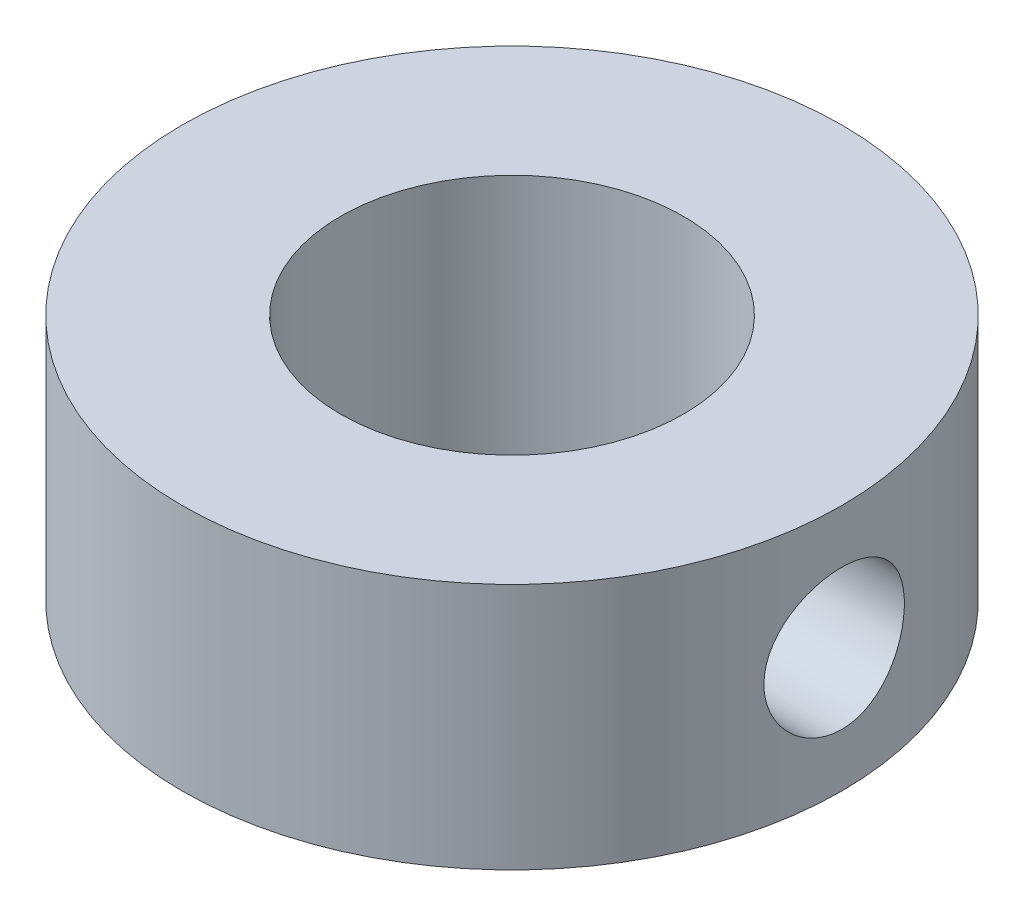
ISO-10303-21;
HEADER;
FILE_DESCRIPTION(('STEP AP214'),'2;1');
FILE_NAME('part.step','',(''),(''),'','','');
FILE_SCHEMA(('AUTOMOTIVE_DESIGN { 1 0 10303 214 1 1 1 1 }'));
ENDSEC;
DATA;
#1=APPLICATION_CONTEXT('core data for automotive mechanical design processes');
#2=APPLICATION_PROTOCOL_DEFINITION('international standard','automotive_design',2000,#1);
#3=PRODUCT_CONTEXT('',#1,'mechanical');
#4=PRODUCT('Part','Part','',(#3));
#5=PRODUCT_RELATED_PRODUCT_CATEGORY('part','',(#4));
#6=PRODUCT_DEFINITION_FORMATION('','',#4);
#7=PRODUCT_DEFINITION_CONTEXT('part definition',#1,'design');
#8=PRODUCT_DEFINITION('design','',#6,#7);
#9=PRODUCT_DEFINITION_SHAPE('','',#8);
#10=(LENGTH_UNIT() NAMED_UNIT(*) SI_UNIT(.MILLI.,.METRE.));
#11=(NAMED_UNIT(*) PLANE_ANGLE_UNIT() SI_UNIT($,.RADIAN.));
#12=(NAMED_UNIT(*) SI_UNIT($,.STERADIAN.) SOLID_ANGLE_UNIT());
#13=UNCERTAINTY_MEASURE_WITH_UNIT(LENGTH_MEASURE(1.E-05),#10,'distance_accuracy_value','');
#14=(GEOMETRIC_REPRESENTATION_CONTEXT(3) GLOBAL_UNCERTAINTY_ASSIGNED_CONTEXT((#13)) GLOBAL_UNIT_ASSIGNED_CONTEXT((#10,
#11,#12)) REPRESENTATION_CONTEXT('',''));
#15=CARTESIAN_POINT('',(0.,0.,0.));
#16=DIRECTION('',(0.,0.,1.));
#17=DIRECTION('',(1.,0.,0.));
#18=AXIS2_PLACEMENT_3D('',#15,#16,#17);
#19=CARTESIAN_POINT('',(0.,4.7625,0.));
#20=DIRECTION('',(0.,1.,0.));
#21=DIRECTION('',(0.,0.,1.));
#22=AXIS2_PLACEMENT_3D('',#19,#20,#21);
#23=PLANE('',#22);
#24=CARTESIAN_POINT('',(0.,4.7625,0.));
#25=DIRECTION('',(0.,1.,0.));
#26=DIRECTION('',(0.,0.,1.));
#27=AXIS2_PLACEMENT_3D('',#24,#25,#26);
#28=CIRCLE('',#27,6.35);
#29=CARTESIAN_POINT('',(0.,4.7625,6.35));
#30=VERTEX_POINT('',#29);
#31=EDGE_CURVE('E58',#30,#30,#28,.T.);
#32=ORIENTED_EDGE('',*,*,#31,.T.);
#33=EDGE_LOOP('',(#32));
#34=FACE_BOUND('',#33,.T.);
#35=CARTESIAN_POINT('',(0.,4.7625,0.));
#36=DIRECTION('',(0.,1.,0.));
#37=DIRECTION('',(0.,0.,1.));
#38=AXIS2_PLACEMENT_3D('',#35,#36,#37);
#39=CIRCLE('',#38,3.302);
#40=CARTESIAN_POINT('',(0.,4.7625,3.302));
#41=VERTEX_POINT('',#40);
#42=EDGE_CURVE('E67',#41,#41,#39,.T.);
#43=ORIENTED_EDGE('',*,*,#42,.F.);
#44=EDGE_LOOP('',(#43));
#45=FACE_BOUND('',#44,.T.);
#46=ADVANCED_FACE('F46',(#34,#45),#23,.T.);
#47=CARTESIAN_POINT('',(0.,0.,0.));
#48=DIRECTION('',(0.,1.,0.));
#49=DIRECTION('',(0.,0.,1.));
#50=AXIS2_PLACEMENT_3D('',#47,#48,#49);
#51=PLANE('',#50);
#52=CARTESIAN_POINT('',(0.,0.,0.));
#53=DIRECTION('',(0.,1.,0.));
#54=DIRECTION('',(0.,0.,1.));
#55=AXIS2_PLACEMENT_3D('',#52,#53,#54);
#56=CIRCLE('',#55,6.35);
#57=CARTESIAN_POINT('',(0.,0.,6.35));
#58=VERTEX_POINT('',#57);
#59=EDGE_CURVE('E62',#58,#58,#56,.T.);
#60=ORIENTED_EDGE('',*,*,#59,.F.);
#61=EDGE_LOOP('',(#60));
#62=FACE_BOUND('',#61,.T.);
#63=CARTESIAN_POINT('',(0.,0.,0.));
#64=DIRECTION('',(0.,1.,0.));
#65=DIRECTION('',(0.,0.,1.));
#66=AXIS2_PLACEMENT_3D('',#63,#64,#65);
#67=CIRCLE('',#66,3.302);
#68=CARTESIAN_POINT('',(0.,0.,3.302));
#69=VERTEX_POINT('',#68);
#70=EDGE_CURVE('E69',#69,#69,#67,.T.);
#71=ORIENTED_EDGE('',*,*,#70,.T.);
#72=EDGE_LOOP('',(#71));
#73=FACE_BOUND('',#72,.T.);
#74=ADVANCED_FACE('F94',(#62,#73),#51,.F.);
#75=CARTESIAN_POINT('',(0.,4.7625,0.));
#76=DIRECTION('',(0.,-1.,0.));
#77=DIRECTION('',(0.,0.,-1.));
#78=AXIS2_PLACEMENT_3D('',#75,#76,#77);
#79=CYLINDRICAL_SURFACE('',#78,6.35);
#80=CARTESIAN_POINT('',(6.35,1.0287,0.));
#81=CARTESIAN_POINT('',(6.34999861096237,1.02870262926583,0.0750646140818435));
#82=CARTESIAN_POINT('',(6.34865540088408,1.03497007342242,0.150161450028055));
#83=CARTESIAN_POINT('',(6.34342675076644,1.05985015835992,0.298225296339674));
#84=CARTESIAN_POINT('',(6.33953943023363,1.07847193105148,0.371190689529798));
#85=CARTESIAN_POINT('',(6.32965577699744,1.127453560802,0.512830125656908));
#86=CARTESIAN_POINT('',(6.32366159067733,1.15780147489093,0.581508452531715));
#87=CARTESIAN_POINT('',(6.31021261659612,1.2293367641681,0.712795420037444));
#88=CARTESIAN_POINT('',(6.30275788196482,1.27052374508651,0.775404281331161));
#89=CARTESIAN_POINT('',(6.28707845908267,1.36323358759373,0.893733729529973));
#90=CARTESIAN_POINT('',(6.27884463503177,1.41489010254452,0.949348399501573));
#91=CARTESIAN_POINT('',(6.26260005999281,1.52678562126354,1.05119276861777));
#92=CARTESIAN_POINT('',(6.25458932813968,1.58702535853312,1.09742166485733));
#93=CARTESIAN_POINT('',(6.23960815322762,1.71515378803313,1.17964434517394));
#94=CARTESIAN_POINT('',(6.23264943245589,1.78311570901699,1.21552634219633));
#95=CARTESIAN_POINT('',(6.22069088315544,1.92427717832486,1.27531989778063));
#96=CARTESIAN_POINT('',(6.21569083337163,1.99747613395837,1.29923280847738));
#97=CARTESIAN_POINT('',(6.20830861045501,2.14588776815441,1.33406128746238));
#98=CARTESIAN_POINT('',(6.20588881195717,2.22105465072955,1.34516385912344));
#99=CARTESIAN_POINT('',(6.20382799290792,2.37222015748742,1.35463777151121));
#100=CARTESIAN_POINT('',(6.20418664902391,2.44821868386278,1.35301059361624));
#101=CARTESIAN_POINT('',(6.20760811333917,2.59750693875617,1.33722190727113));
#102=CARTESIAN_POINT('',(6.2106242486392,2.67082077708714,1.32327672735781));
#103=CARTESIAN_POINT('',(6.21894713261562,2.81404389654533,1.28359022137343));
#104=CARTESIAN_POINT('',(6.22425400382448,2.88395299532887,1.25784826428298));
#105=CARTESIAN_POINT('',(6.23660694361686,3.01899512270446,1.19509780651165));
#106=CARTESIAN_POINT('',(6.24366590013669,3.08408789770983,1.15800532064544));
#107=CARTESIAN_POINT('',(6.25871962533893,3.20720569095366,1.07366584098501));
#108=CARTESIAN_POINT('',(6.2667145152598,3.26522979154281,1.02641753096658));
#109=CARTESIAN_POINT('',(6.2829401548711,3.37380951230373,0.92195834344795));
#110=CARTESIAN_POINT('',(6.29117238219288,3.42418789717209,0.864563295807784));
#111=CARTESIAN_POINT('',(6.30679580872777,3.51463205820037,0.742047254963457));
#112=CARTESIAN_POINT('',(6.31418699419339,3.55469766580335,0.676926135506121));
#113=CARTESIAN_POINT('',(6.32731762757995,3.62341926064538,0.540596304673299));
#114=CARTESIAN_POINT('',(6.3330538427319,3.65205295843356,0.469376026443029));
#115=CARTESIAN_POINT('',(6.34220404917476,3.69689801425359,0.322985870928895));
#116=CARTESIAN_POINT('',(6.34561836032498,3.71311108335711,0.247816539193656));
#117=CARTESIAN_POINT('',(6.34969483950221,3.73239902949334,0.0971831975907121));
#118=CARTESIAN_POINT('',(6.35040774522148,3.73571614904166,0.021751538849417));
#119=CARTESIAN_POINT('',(6.34914287490065,3.72977330025944,-0.128588082469588));
#120=CARTESIAN_POINT('',(6.34716527145521,3.72051413869039,-0.203496078330149));
#121=CARTESIAN_POINT('',(6.34077352324428,3.68988256614094,-0.34986603445753));
#122=CARTESIAN_POINT('',(6.33638477329703,3.66863634417797,-0.42135560989196));
#123=CARTESIAN_POINT('',(6.32566160887462,3.61477313313308,-0.55975672690124));
#124=CARTESIAN_POINT('',(6.319327034669,3.58215521053168,-0.626667892088094));
#125=CARTESIAN_POINT('',(6.30528928586047,3.50596371428637,-0.755020804805227));
#126=CARTESIAN_POINT('',(6.29756861532476,3.4622467171387,-0.816375459390217));
#127=CARTESIAN_POINT('',(6.28165242253472,3.3652878895313,-0.930964829041668));
#128=CARTESIAN_POINT('',(6.2734568420981,3.3120448903443,-0.984198546279223));
#129=CARTESIAN_POINT('',(6.2573405892671,3.19643650001011,-1.08198553722146));
#130=CARTESIAN_POINT('',(6.2494271894923,3.13392839626009,-1.1263715051453));
#131=CARTESIAN_POINT('',(6.23493483661358,3.00220226908075,-1.20401575994887));
#132=CARTESIAN_POINT('',(6.22835582689793,2.93298453049318,-1.23727451894148));
#133=CARTESIAN_POINT('',(6.21733781696005,2.79016968084998,-1.29150180342355));
#134=CARTESIAN_POINT('',(6.21288706126121,2.71659920943202,-1.31253798284658));
#135=CARTESIAN_POINT('',(6.2066070485769,2.56686138055767,-1.34192355845653));
#136=CARTESIAN_POINT('',(6.20477739714954,2.49069441560615,-1.35027486356241));
#137=CARTESIAN_POINT('',(6.20397068907972,2.33961026780643,-1.3539756757237));
#138=CARTESIAN_POINT('',(6.20493549674238,2.26469976296864,-1.34959015346798));
#139=CARTESIAN_POINT('',(6.20947801810159,2.11671112369889,-1.32853178134124));
#140=CARTESIAN_POINT('',(6.21305570424062,2.04363296994988,-1.31185906106091));
#141=CARTESIAN_POINT('',(6.22239325528924,1.90158076051665,-1.26682455867663));
#142=CARTESIAN_POINT('',(6.22814627217719,1.83259460348016,-1.23849943440763));
#143=CARTESIAN_POINT('',(6.24118930990987,1.70031364974268,-1.17099639387991));
#144=CARTESIAN_POINT('',(6.24847948123033,1.63701941110316,-1.13181741499343));
#145=CARTESIAN_POINT('',(6.26395040356261,1.51660858217255,-1.04283172893201));
#146=CARTESIAN_POINT('',(6.27214556837561,1.45963396540364,-0.99283538063987));
#147=CARTESIAN_POINT('',(6.2884042122436,1.35479601418252,-0.884020822113279));
#148=CARTESIAN_POINT('',(6.29646766049922,1.30693478360923,-0.825200580420685));
#149=CARTESIAN_POINT('',(6.31167047796941,1.22112709781633,-0.699546337421048));
#150=CARTESIAN_POINT('',(6.31879741398043,1.18330832380207,-0.632623562218124));
#151=CARTESIAN_POINT('',(6.33120028356375,1.11951532799377,-0.493235348200115));
#152=CARTESIAN_POINT('',(6.33647780542986,1.09353093694708,-0.420774730811316));
#153=CARTESIAN_POINT('',(6.34361905124058,1.05890256521987,-0.290176827311201));
#154=CARTESIAN_POINT('',(6.34599734619059,1.04759775961252,-0.232758269670467));
#155=CARTESIAN_POINT('',(6.34918833005957,1.03249560372685,-0.11689962831609));
#156=CARTESIAN_POINT('',(6.35000108176889,1.02869795235355,-0.0584595856667481));
#157=CARTESIAN_POINT('',(6.35,1.0287,0.));
#158=B_SPLINE_CURVE_WITH_KNOTS('',3,(#80,#81,#82,#83,#84,#85,#86,#87,#88,#89,#90,#91,#92,#93,
#94,#95,#96,#97,#98,#99,#100,#101,#102,#103,#104,#105,#106,#107,#108,#109,#110,#111,#112,#113,
#114,#115,#116,#117,#118,#119,#120,#121,#122,#123,#124,#125,#126,#127,#128,#129,#130,#131,#132,
#133,#134,#135,#136,#137,#138,#139,#140,#141,#142,#143,#144,#145,#146,#147,#148,#149,#150,#151,
#152,#153,#154,#155,#156,#157),.UNSPECIFIED.,.T.,.F.,(4,2,2,2,2,2,2,2,2,2,2,2,2,2,2,2,2,2,2,2,2,
2,2,2,2,2,2,2,2,2,2,2,2,2,2,2,2,2,4),(0.,0.224979895980791,0.450126275209806,0.67504394674997,
0.899953438065849,1.12793886928434,1.355943795283,1.58632693132888,1.81668403536191,
2.04363409247309,2.27055773948938,2.4935736737059,2.71660153862233,2.94132126356156,
3.16607013040717,3.39542056996827,3.6247747579039,3.85457397221981,4.08434152359175,
4.3097715649296,4.53518714573762,4.75827288077635,4.98137693356217,5.20752538847285,
5.43370160816211,5.66381649384173,5.89392161481026,6.12274062574888,6.35152519880279,
6.57558456164185,6.79964156140387,7.02299901575427,7.24637834526044,7.47404733340156,
7.70176881671732,7.93226022587938,8.16255319898056,8.33777236451398,8.51298450226033),.UNSPECIFIED.);
#159=CARTESIAN_POINT('',(6.35,1.0287,0.));
#160=VERTEX_POINT('',#159);
#161=EDGE_CURVE('E12',#160,#160,#158,.T.);
#162=ORIENTED_EDGE('',*,*,#161,.T.);
#163=EDGE_LOOP('',(#162));
#164=FACE_BOUND('',#163,.T.);
#165=ORIENTED_EDGE('',*,*,#31,.F.);
#166=EDGE_LOOP('',(#165));
#167=FACE_BOUND('',#166,.T.);
#168=ORIENTED_EDGE('',*,*,#59,.T.);
#169=EDGE_LOOP('',(#168));
#170=FACE_BOUND('',#169,.T.);
#171=ADVANCED_FACE('F48',(#164,#167,#170),#79,.T.);
#172=CARTESIAN_POINT('',(0.,4.7625,0.));
#173=DIRECTION('',(0.,-1.,0.));
#174=DIRECTION('',(0.,0.,-1.));
#175=AXIS2_PLACEMENT_3D('',#172,#173,#174);
#176=CYLINDRICAL_SURFACE('',#175,3.302);
#177=CARTESIAN_POINT('',(3.01227696228285,2.38125,1.35255));
#178=CARTESIAN_POINT('',(3.01228413561645,2.45351548321077,1.35254248260982));
#179=CARTESIAN_POINT('',(3.01491523885822,2.52590392565766,1.3467217484186));
#180=CARTESIAN_POINT('',(3.02510764792306,2.66859916637362,1.32366014717873));
#181=CARTESIAN_POINT('',(3.03268254488514,2.73889966594904,1.30638779604779));
#182=CARTESIAN_POINT('',(3.0517486091206,2.87510049832418,1.26120126363111));
#183=CARTESIAN_POINT('',(3.06322415712815,2.94101714567429,1.23332947329745));
#184=CARTESIAN_POINT('',(3.0887761993922,3.06721893625558,1.1678593201578));
#185=CARTESIAN_POINT('',(3.10285201719634,3.12750553799929,1.13026348601712));
#186=CARTESIAN_POINT('',(3.13296517553289,3.24439664272884,1.04399623887497));
#187=CARTESIAN_POINT('',(3.1490676028292,3.30062158556178,0.994832998716333));
#188=CARTESIAN_POINT('',(3.18088365827053,3.40430807369912,0.887860027367417));
#189=CARTESIAN_POINT('',(3.19659713747826,3.45176630564367,0.830047041904729));
#190=CARTESIAN_POINT('',(3.22665136006023,3.53848463980052,0.704456501366742));
#191=CARTESIAN_POINT('',(3.24090761319944,3.57732070358892,0.636364101552747));
#192=CARTESIAN_POINT('',(3.26564796040492,3.64282358264983,0.493923728288));
#193=CARTESIAN_POINT('',(3.2761336753681,3.66949562837449,0.41957845985077));
#194=CARTESIAN_POINT('',(3.29169035821278,3.70854702895594,0.270724745514724));
#195=CARTESIAN_POINT('',(3.29700800789008,3.72158008643264,0.196414100813201));
#196=CARTESIAN_POINT('',(3.30252356479895,3.73509269691809,0.0464830534180062));
#197=CARTESIAN_POINT('',(3.30272347536086,3.735577162053,-0.0291368251781664));
#198=CARTESIAN_POINT('',(3.29812835053492,3.72432815264686,-0.174798506016255));
#199=CARTESIAN_POINT('',(3.29362659221103,3.71331206721361,-0.244906670763242));
#200=CARTESIAN_POINT('',(3.28053352738941,3.68060034584298,-0.382177631899093));
#201=CARTESIAN_POINT('',(3.2719419199996,3.65890392414435,-0.449340211182771));
#202=CARTESIAN_POINT('',(3.25133936047833,3.60518532104079,-0.580037494247253));
#203=CARTESIAN_POINT('',(3.23927843476339,3.57301124812234,-0.643501564815325));
#204=CARTESIAN_POINT('',(3.21292461701675,3.4993965920399,-0.764295218402089));
#205=CARTESIAN_POINT('',(3.19863094603685,3.45795277270879,-0.82162264869477));
#206=CARTESIAN_POINT('',(3.16809835879315,3.36367338094314,-0.932683092927922));
#207=CARTESIAN_POINT('',(3.15179326196152,3.31025228917206,-0.985901597415429));
#208=CARTESIAN_POINT('',(3.11981865659247,3.19519523233306,-1.08284197029004));
#209=CARTESIAN_POINT('',(3.10414937871959,3.13355632012318,-1.12656041682656));
#210=CARTESIAN_POINT('',(3.07475755320483,3.00140284690525,-1.20451810029512));
#211=CARTESIAN_POINT('',(3.06110998285575,2.93067312158606,-1.23842326292848));
#212=CARTESIAN_POINT('',(3.03819351456928,2.78380018251667,-1.29363377660903));
#213=CARTESIAN_POINT('',(3.02892160931135,2.70766072831091,-1.3149477838881));
#214=CARTESIAN_POINT('',(3.01654517971901,2.55727624913239,-1.34308683587813));
#215=CARTESIAN_POINT('',(3.01308741859208,2.48321637848135,-1.35074361270845));
#216=CARTESIAN_POINT('',(3.01172234160753,2.33480533931019,-1.35378654087621));
#217=CARTESIAN_POINT('',(3.01381321019128,2.26045427402074,-1.34917670595157));
#218=CARTESIAN_POINT('',(3.02294587176201,2.11834238771882,-1.32857559026262));
#219=CARTESIAN_POINT('',(3.0296780997082,2.05045611672513,-1.31329522278472));
#220=CARTESIAN_POINT('',(3.04694427256322,1.91826213586142,-1.27272035115313));
#221=CARTESIAN_POINT('',(3.05747908639707,1.85395524779225,-1.24742355802801));
#222=CARTESIAN_POINT('',(3.08169855817771,1.72775728130769,-1.18636263889681));
#223=CARTESIAN_POINT('',(3.09549605963574,1.66607812802004,-1.1502066981814));
#224=CARTESIAN_POINT('',(3.12452094224662,1.54937257767059,-1.06884816693182));
#225=CARTESIAN_POINT('',(3.1397489255964,1.49434900494103,-1.02364175723656));
#226=CARTESIAN_POINT('',(3.17135568240869,1.38804291250956,-0.921297843801847));
#227=CARTESIAN_POINT('',(3.18773137225284,1.33738895022001,-0.863503963768846));
#228=CARTESIAN_POINT('',(3.21867689842495,1.24639194419981,-0.739851601568534));
#229=CARTESIAN_POINT('',(3.23324662833525,1.2060495079356,-0.673992644614136));
#230=CARTESIAN_POINT('',(3.25901152848775,1.1369121076186,-0.53571807159732));
#231=CARTESIAN_POINT('',(3.27020226141098,1.10813231144901,-0.463293994966378));
#232=CARTESIAN_POINT('',(3.28788736395986,1.06336604114984,-0.314058230591265));
#233=CARTESIAN_POINT('',(3.2943844241663,1.04737223707168,-0.237249083818835));
#234=CARTESIAN_POINT('',(3.30165011769247,1.02953241742592,-0.0870524980722293));
#235=CARTESIAN_POINT('',(3.30277790607436,1.02679913683118,-0.0137870623603064));
#236=CARTESIAN_POINT('',(3.30016169957743,1.03319065123932,0.132127947833593));
#237=CARTESIAN_POINT('',(3.2964185090047,1.04231348853521,0.204777621997849));
#238=CARTESIAN_POINT('',(3.28466596321497,1.0715220766484,0.344902607349558));
#239=CARTESIAN_POINT('',(3.2768033217629,1.09123136579942,0.412469700605216));
#240=CARTESIAN_POINT('',(3.25766562266528,1.14064926439771,0.543318778228889));
#241=CARTESIAN_POINT('',(3.24638990591759,1.17035980532035,0.606599932044124));
#242=CARTESIAN_POINT('',(3.22089567407662,1.24043130257424,0.730202630024193));
#243=CARTESIAN_POINT('',(3.20656788692768,1.28121003806636,0.790264283227959));
#244=CARTESIAN_POINT('',(3.17668037965697,1.37164344153236,0.902944968957544));
#245=CARTESIAN_POINT('',(3.16112022273479,1.42130126451855,0.955561344003588));
#246=CARTESIAN_POINT('',(3.12924890948818,1.53191581060449,1.05542930841159));
#247=CARTESIAN_POINT('',(3.11295513329873,1.59339887096137,1.10210554337568));
#248=CARTESIAN_POINT('',(3.08252803798576,1.72384623500186,1.18455234501883));
#249=CARTESIAN_POINT('',(3.06839590670867,1.79281461661751,1.22031692628956));
#250=CARTESIAN_POINT('',(3.04420278020083,1.93594797378973,1.27947371738456));
#251=CARTESIAN_POINT('',(3.03411288229427,2.01007144081245,1.30295414487605));
#252=CARTESIAN_POINT('',(3.01934120793908,2.1616183028357,1.33683930755717));
#253=CARTESIAN_POINT('',(3.01464129390335,2.23902971619025,1.34728790601142));
#254=CARTESIAN_POINT('',(3.01250575130628,2.33818613654134,1.35203813468706));
#255=CARTESIAN_POINT('',(3.01227482440326,2.35971260747929,1.35255224041929));
#256=CARTESIAN_POINT('',(3.01227696228285,2.38125,1.35255));
#257=B_SPLINE_CURVE_WITH_KNOTS('',3,(#177,#178,#179,#180,#181,#182,#183,#184,#185,#186,#187,
#188,#189,#190,#191,#192,#193,#194,#195,#196,#197,#198,#199,#200,#201,#202,#203,#204,#205,#206,
#207,#208,#209,#210,#211,#212,#213,#214,#215,#216,#217,#218,#219,#220,#221,#222,#223,#224,#225,
#226,#227,#228,#229,#230,#231,#232,#233,#234,#235,#236,#237,#238,#239,#240,#241,#242,#243,#244,
#245,#246,#247,#248,#249,#250,#251,#252,#253,#254,#255,#256),.UNSPECIFIED.,.T.,.F.,(4,2,2,2,2,2,
2,2,2,2,2,2,2,2,2,2,2,2,2,2,2,2,2,2,2,2,2,2,2,2,2,2,2,2,2,2,2,2,2,4),(0.,0.21673644824016,
0.434071257618086,0.650545855744783,0.866964217759019,1.09517357010099,1.32346899799901,
1.56127780464681,1.79898425834994,2.02468772241007,2.25030283387879,2.46263973136262,
2.67499225298447,2.8905714939916,3.10622611380269,3.33663983398965,3.56713641042968,
3.80474442813777,4.04218890319294,4.2646034718082,4.48694527346679,4.69573368406723,
4.90456983492959,5.12209734771142,5.33971684803323,5.57434581458792,5.80898860027982,
6.04393819340752,6.27875299794089,6.49761665786984,6.71644418316462,6.92796053791941,
7.13951776488118,7.36055992802757,7.58168079089059,7.81725300355977,8.05295420412979,
8.28693865932613,8.52013341227929,8.58472770753471),.UNSPECIFIED.);
#258=CARTESIAN_POINT('',(3.01227696228285,2.38125,1.35255));
#259=VERTEX_POINT('',#258);
#260=EDGE_CURVE('E72',#259,#259,#257,.T.);
#261=ORIENTED_EDGE('',*,*,#260,.F.);
#262=EDGE_LOOP('',(#261));
#263=FACE_BOUND('',#262,.T.);
#264=ORIENTED_EDGE('',*,*,#42,.T.);
#265=EDGE_LOOP('',(#264));
#266=FACE_BOUND('',#265,.T.);
#267=ORIENTED_EDGE('',*,*,#70,.F.);
#268=EDGE_LOOP('',(#267));
#269=FACE_BOUND('',#268,.T.);
#270=ADVANCED_FACE('F80',(#263,#266,#269),#176,.F.);
#271=CARTESIAN_POINT('',(0.,2.38125,0.));
#272=DIRECTION('',(-1.,0.,0.));
#273=DIRECTION('',(0.,0.,1.));
#274=AXIS2_PLACEMENT_3D('',#271,#272,#273);
#275=CYLINDRICAL_SURFACE('',#274,1.35255);
#276=ORIENTED_EDGE('',*,*,#260,.T.);
#277=EDGE_LOOP('',(#276));
#278=FACE_BOUND('',#277,.T.);
#279=ORIENTED_EDGE('',*,*,#161,.F.);
#280=EDGE_LOOP('',(#279));
#281=FACE_BOUND('',#280,.T.);
#282=ADVANCED_FACE('F83',(#278,#281),#275,.F.);
#283=CLOSED_SHELL('',(#46,#74,#171,#270,#282));
#284=MANIFOLD_SOLID_BREP('B2',#283);
#285=ADVANCED_BREP_SHAPE_REPRESENTATION('',(#18,#284),#14);
#286=SHAPE_DEFINITION_REPRESENTATION(#9,#285);
ENDSEC;
END-ISO-10303-21;
